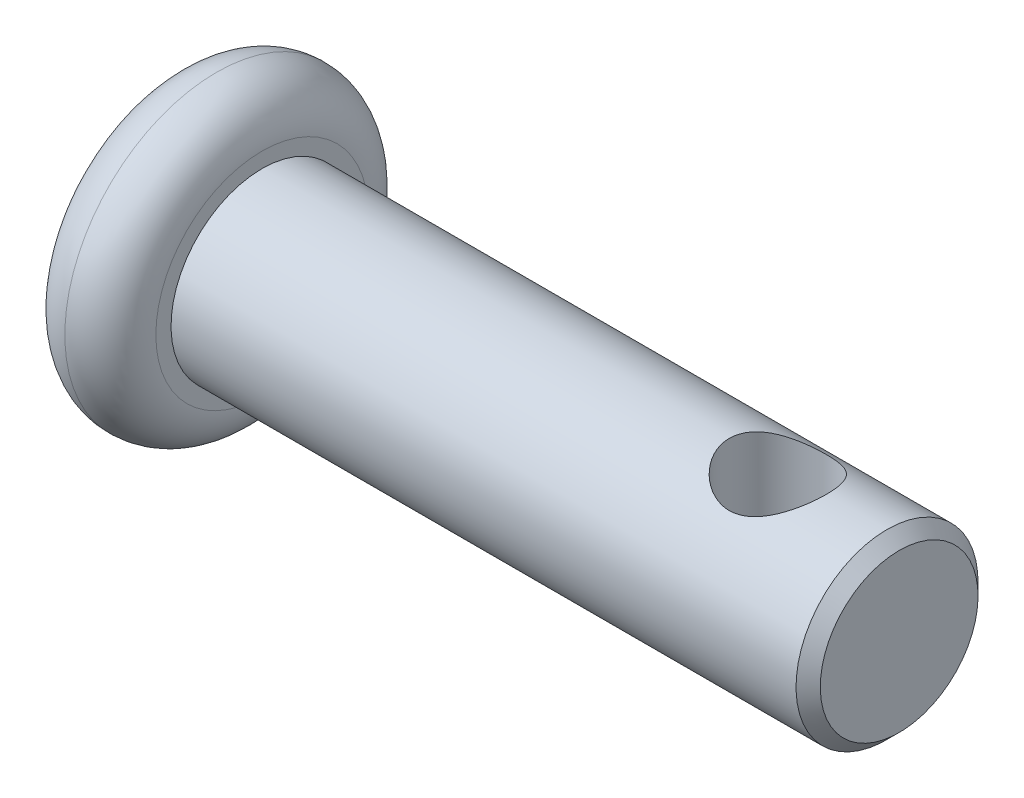
ISO-10303-21;
HEADER;
FILE_DESCRIPTION(('STEP AP214'),'2;1');
FILE_NAME('part.step','',(''),(''),'','','');
FILE_SCHEMA(('AUTOMOTIVE_DESIGN { 1 0 10303 214 1 1 1 1 }'));
ENDSEC;
DATA;
#1=APPLICATION_CONTEXT('core data for automotive mechanical design processes');
#2=APPLICATION_PROTOCOL_DEFINITION('international standard','automotive_design',2000,#1);
#3=PRODUCT_CONTEXT('',#1,'mechanical');
#4=PRODUCT('Part','Part','',(#3));
#5=PRODUCT_RELATED_PRODUCT_CATEGORY('part','',(#4));
#6=PRODUCT_DEFINITION_FORMATION('','',#4);
#7=PRODUCT_DEFINITION_CONTEXT('part definition',#1,'design');
#8=PRODUCT_DEFINITION('design','',#6,#7);
#9=PRODUCT_DEFINITION_SHAPE('','',#8);
#10=(LENGTH_UNIT() NAMED_UNIT(*) SI_UNIT(.MILLI.,.METRE.));
#11=(NAMED_UNIT(*) PLANE_ANGLE_UNIT() SI_UNIT($,.RADIAN.));
#12=(NAMED_UNIT(*) SI_UNIT($,.STERADIAN.) SOLID_ANGLE_UNIT());
#13=UNCERTAINTY_MEASURE_WITH_UNIT(LENGTH_MEASURE(1.E-05),#10,'distance_accuracy_value','');
#14=(GEOMETRIC_REPRESENTATION_CONTEXT(3) GLOBAL_UNCERTAINTY_ASSIGNED_CONTEXT((#13)) GLOBAL_UNIT_ASSIGNED_CONTEXT((#10,
#11,#12)) REPRESENTATION_CONTEXT('',''));
#15=CARTESIAN_POINT('',(0.,0.,0.));
#16=DIRECTION('',(0.,0.,1.));
#17=DIRECTION('',(1.,0.,0.));
#18=AXIS2_PLACEMENT_3D('',#15,#16,#17);
#19=CARTESIAN_POINT('',(0.,0.,0.));
#20=DIRECTION('',(-1.,0.,0.));
#21=DIRECTION('',(0.,-1.,0.));
#22=AXIS2_PLACEMENT_3D('',#19,#20,#21);
#23=PLANE('',#22);
#24=CARTESIAN_POINT('',(0.,0.,0.));
#25=DIRECTION('',(-1.,0.,0.));
#26=DIRECTION('',(0.,-1.,0.));
#27=AXIS2_PLACEMENT_3D('',#24,#25,#26);
#28=CIRCLE('',#27,1.75);
#29=CARTESIAN_POINT('',(0.,-1.75,0.));
#30=VERTEX_POINT('',#29);
#31=EDGE_CURVE('E40',#30,#30,#28,.T.);
#32=ORIENTED_EDGE('',*,*,#31,.T.);
#33=EDGE_LOOP('',(#32));
#34=FACE_BOUND('',#33,.T.);
#35=ADVANCED_FACE('F32',(#34),#23,.T.);
#36=CARTESIAN_POINT('',(1.5,2.5,0.));
#37=DIRECTION('',(1.,0.,0.));
#38=DIRECTION('',(0.,1.,0.));
#39=AXIS2_PLACEMENT_3D('',#36,#37,#38);
#40=PLANE('',#39);
#41=CARTESIAN_POINT('',(1.5,0.,0.));
#42=DIRECTION('',(1.,0.,0.));
#43=DIRECTION('',(0.,1.,0.));
#44=AXIS2_PLACEMENT_3D('',#41,#42,#43);
#45=CIRCLE('',#44,1.75);
#46=CARTESIAN_POINT('',(1.5,1.75,0.));
#47=VERTEX_POINT('',#46);
#48=EDGE_CURVE('E10',#47,#47,#45,.T.);
#49=ORIENTED_EDGE('',*,*,#48,.T.);
#50=EDGE_LOOP('',(#49));
#51=FACE_BOUND('',#50,.T.);
#52=CARTESIAN_POINT('',(1.5,0.,0.));
#53=DIRECTION('',(1.,0.,0.));
#54=DIRECTION('',(0.,1.,0.));
#55=AXIS2_PLACEMENT_3D('',#52,#53,#54);
#56=CIRCLE('',#55,1.5);
#57=CARTESIAN_POINT('',(1.5,1.5,0.));
#58=VERTEX_POINT('',#57);
#59=EDGE_CURVE('E52',#58,#58,#56,.T.);
#60=ORIENTED_EDGE('',*,*,#59,.F.);
#61=EDGE_LOOP('',(#60));
#62=FACE_BOUND('',#61,.T.);
#63=ADVANCED_FACE('F82',(#51,#62),#40,.T.);
#64=CARTESIAN_POINT('',(12.,0.,0.));
#65=DIRECTION('',(1.,0.,0.));
#66=DIRECTION('',(0.,1.,0.));
#67=AXIS2_PLACEMENT_3D('',#64,#65,#66);
#68=CYLINDRICAL_SURFACE('',#67,1.5);
#69=CARTESIAN_POINT('',(11.8,0.,0.));
#70=DIRECTION('',(1.,0.,0.));
#71=DIRECTION('',(0.,1.,0.));
#72=AXIS2_PLACEMENT_3D('',#69,#70,#71);
#73=CIRCLE('',#72,1.5);
#74=CARTESIAN_POINT('',(11.8,1.5,0.));
#75=VERTEX_POINT('',#74);
#76=EDGE_CURVE('E44',#75,#75,#73,.F.);
#77=ORIENTED_EDGE('',*,*,#76,.T.);
#78=EDGE_LOOP('',(#77));
#79=FACE_BOUND('',#78,.T.);
#80=CARTESIAN_POINT('',(9.2,1.5,0.));
#81=CARTESIAN_POINT('',(9.20000270828978,1.49999758414449,0.0417140042937091));
#82=CARTESIAN_POINT('',(9.20328159641244,1.49824189360224,0.0834672912539171));
#83=CARTESIAN_POINT('',(9.21624170086605,1.49139129667971,0.165718197334509));
#84=CARTESIAN_POINT('',(9.22593283300351,1.48629121869364,0.206213769841148));
#85=CARTESIAN_POINT('',(9.25121983985831,1.47328036800654,0.284638594945812));
#86=CARTESIAN_POINT('',(9.26679181418988,1.465380979915,0.322577512237573));
#87=CARTESIAN_POINT('',(9.30326255171199,1.4474774987237,0.395235474229212));
#88=CARTESIAN_POINT('',(9.3241613390756,1.43747339607276,0.429954504316264));
#89=CARTESIAN_POINT('',(9.37225156173175,1.41547900666031,0.49776731945964));
#90=CARTESIAN_POINT('',(9.39976760351975,1.4034011481073,0.530602027463186));
#91=CARTESIAN_POINT('',(9.45960314568675,1.37887042167267,0.591434030661654));
#92=CARTESIAN_POINT('',(9.49192680673365,1.36641723648963,0.619427089896367));
#93=CARTESIAN_POINT('',(9.56397805847776,1.34122140682262,0.6723544195111));
#94=CARTESIAN_POINT('',(9.60411204866305,1.32855595701365,0.696776837026745));
#95=CARTESIAN_POINT('',(9.68864568135116,1.30586838669548,0.738426416316997));
#96=CARTESIAN_POINT('',(9.73304199480675,1.29584422578236,0.755659138193532));
#97=CARTESIAN_POINT('',(9.82205426936129,1.28057394848523,0.781243551670883));
#98=CARTESIAN_POINT('',(9.86648297209041,1.27506829565278,0.790083117424792));
#99=CARTESIAN_POINT('',(9.95650387196575,1.26881331156942,0.800094972405449));
#100=CARTESIAN_POINT('',(10.0020945261342,1.26805797215382,0.801276946959554));
#101=CARTESIAN_POINT('',(10.0862218656466,1.27118648805135,0.796296021649254));
#102=CARTESIAN_POINT('',(10.1248484466222,1.2744325135639,0.791143222976707));
#103=CARTESIAN_POINT('',(10.200574623942,1.28406317281931,0.775413455073685));
#104=CARTESIAN_POINT('',(10.2376735995057,1.29044906914779,0.764834303757537));
#105=CARTESIAN_POINT('',(10.3103380265736,1.30576277857079,0.738390252390663));
#106=CARTESIAN_POINT('',(10.345850303085,1.31474447400447,0.722411944930875));
#107=CARTESIAN_POINT('',(10.4138695263574,1.33425047082889,0.685716522966989));
#108=CARTESIAN_POINT('',(10.446375132369,1.34477545505385,0.664997308543693));
#109=CARTESIAN_POINT('',(10.5124858612133,1.36804524940245,0.615868522436845));
#110=CARTESIAN_POINT('',(10.5455507352467,1.38088899493241,0.586776291159892));
#111=CARTESIAN_POINT('',(10.6065753576899,1.40611558623123,0.523451373374353));
#112=CARTESIAN_POINT('',(10.6345319907931,1.41849814710228,0.489215573049463));
#113=CARTESIAN_POINT('',(10.6861377149142,1.44230010999534,0.414022077031181));
#114=CARTESIAN_POINT('',(10.7094311081939,1.45361823088172,0.372785484410792));
#115=CARTESIAN_POINT('',(10.7485478831769,1.47310395304255,0.286226859736145));
#116=CARTESIAN_POINT('',(10.7643779320031,1.48127436501701,0.240908517249559));
#117=CARTESIAN_POINT('',(10.7866776124073,1.4929099561423,0.151832213955906));
#118=CARTESIAN_POINT('',(10.79386070131,1.49673204992477,0.108300131382032));
#119=CARTESIAN_POINT('',(10.8009475032004,1.50050221027202,0.0204895975412045));
#120=CARTESIAN_POINT('',(10.8008554258023,1.50045251716091,-0.0237884072843997));
#121=CARTESIAN_POINT('',(10.7937500711693,1.49667382258832,-0.107545959760607));
#122=CARTESIAN_POINT('',(10.7873653592517,1.49327897244287,-0.147096449267731));
#123=CARTESIAN_POINT('',(10.7688925579021,1.48362188327846,-0.224469554831582));
#124=CARTESIAN_POINT('',(10.7568038751433,1.47735934596487,-0.262291990687246));
#125=CARTESIAN_POINT('',(10.7270250575318,1.46232570811689,-0.336250167522202));
#126=CARTESIAN_POINT('',(10.7092027650817,1.4534959496239,-0.372320333376869));
#127=CARTESIAN_POINT('',(10.6686248456984,1.43413438081761,-0.441062157410961));
#128=CARTESIAN_POINT('',(10.6458672936231,1.42360190671964,-0.473732482002725));
#129=CARTESIAN_POINT('',(10.5932551988923,1.40047645695353,-0.538489644606411));
#130=CARTESIAN_POINT('',(10.5629003326711,1.38778372966929,-0.570134865108251));
#131=CARTESIAN_POINT('',(10.4973871640848,1.36252708549313,-0.628109862741502));
#132=CARTESIAN_POINT('',(10.462224461708,1.34996329805962,-0.654434715474711));
#133=CARTESIAN_POINT('',(10.385173513825,1.32549514327965,-0.70274076630891));
#134=CARTESIAN_POINT('',(10.3429918612206,1.31369210729127,-0.724310244689175));
#135=CARTESIAN_POINT('',(10.2547899099138,1.29347935062968,-0.759824848176573));
#136=CARTESIAN_POINT('',(10.2087751858783,1.28506480237657,-0.773780830369481));
#137=CARTESIAN_POINT('',(10.1189861529025,1.27372513461018,-0.792295451806952));
#138=CARTESIAN_POINT('',(10.0754338162845,1.27034308682665,-0.797640611545244));
#139=CARTESIAN_POINT('',(9.98793968581964,1.26816359887642,-0.801103834511685));
#140=CARTESIAN_POINT('',(9.94399817787744,1.26936303319562,-0.79922682474004));
#141=CARTESIAN_POINT('',(9.86265364514195,1.27570247677833,-0.78905635074418));
#142=CARTESIAN_POINT('',(9.82510510927249,1.28034575552508,-0.781570591370405));
#143=CARTESIAN_POINT('',(9.75186604245893,1.29238691721072,-0.761493436479323));
#144=CARTESIAN_POINT('',(9.71617620611579,1.29978582163338,-0.748900147495983));
#145=CARTESIAN_POINT('',(9.64509522045344,1.31707665574429,-0.718080352112419));
#146=CARTESIAN_POINT('',(9.60987143258423,1.32709848411839,-0.699543207429633));
#147=CARTESIAN_POINT('',(9.54279806424025,1.34833960706443,-0.657671226676288));
#148=CARTESIAN_POINT('',(9.51095031464064,1.35955954483521,-0.634333807313367));
#149=CARTESIAN_POINT('',(9.44672690611971,1.38387269806827,-0.579583602633469));
#150=CARTESIAN_POINT('',(9.41494125955117,1.39700212075101,-0.547491018352181));
#151=CARTESIAN_POINT('',(9.35702772961191,1.42222830059072,-0.478150164559821));
#152=CARTESIAN_POINT('',(9.3309035088962,1.43432438618419,-0.440898582826826));
#153=CARTESIAN_POINT('',(9.28456604006334,1.45651015109521,-0.3610220026222));
#154=CARTESIAN_POINT('',(9.26451137357511,1.4665441059256,-0.318288665753909));
#155=CARTESIAN_POINT('',(9.23214637726612,1.48303856571174,-0.229399331630397));
#156=CARTESIAN_POINT('',(9.21981536787766,1.48950860714735,-0.183252846928634));
#157=CARTESIAN_POINT('',(9.20780732872793,1.49584776109147,-0.113807677907483));
#158=CARTESIAN_POINT('',(9.20488511579837,1.49739944315896,-0.0911777471195395));
#159=CARTESIAN_POINT('',(9.20098069784147,1.49947623062919,-0.0457024774465215));
#160=CARTESIAN_POINT('',(9.19999851599603,1.50000132376498,-0.0228571359907307));
#161=CARTESIAN_POINT('',(9.2,1.5,0.));
#162=B_SPLINE_CURVE_WITH_KNOTS('',3,(#80,#81,#82,#83,#84,#85,#86,#87,#88,#89,#90,#91,#92,#93,
#94,#95,#96,#97,#98,#99,#100,#101,#102,#103,#104,#105,#106,#107,#108,#109,#110,#111,#112,#113,
#114,#115,#116,#117,#118,#119,#120,#121,#122,#123,#124,#125,#126,#127,#128,#129,#130,#131,#132,
#133,#134,#135,#136,#137,#138,#139,#140,#141,#142,#143,#144,#145,#146,#147,#148,#149,#150,#151,
#152,#153,#154,#155,#156,#157,#158,#159,#160,#161),.UNSPECIFIED.,.T.,.F.,(4,2,2,2,2,2,2,2,2,2,2,
2,2,2,2,2,2,2,2,2,2,2,2,2,2,2,2,2,2,2,2,2,2,2,2,2,2,2,2,2,4),(0.,0.125049785968992,
0.250293400579708,0.375033395431379,0.499773956363372,0.632758937517728,0.765859685119312,
0.911100210896856,1.0562282067719,1.19228300426694,1.32816568589671,1.44492819552126,
1.5617376954166,1.68117137196064,1.80065805275817,1.93770170276478,2.07482865313358,
2.22012229846782,2.3652859036198,2.49740165319181,2.62944095746675,2.74950324975936,
2.86957803367867,2.99264692026345,3.11576390008819,3.25213772585141,3.38863720347796,
3.53432584534744,3.6798061838978,3.81103787448892,3.94218005404205,4.0573808881827,
4.17262446873054,4.29529226385602,4.41802624681408,4.55851375899382,4.69909188991155,
4.84307664846754,4.98667423094967,5.05519428454422,5.12371515689634),.UNSPECIFIED.);
#163=CARTESIAN_POINT('',(9.2,1.5,0.));
#164=VERTEX_POINT('',#163);
#165=EDGE_CURVE('E53',#164,#164,#162,.T.);
#166=ORIENTED_EDGE('',*,*,#165,.F.);
#167=EDGE_LOOP('',(#166));
#168=FACE_BOUND('',#167,.T.);
#169=CARTESIAN_POINT('',(10.,-1.26885775404495,0.800000000000001));
#170=CARTESIAN_POINT('',(9.95876273448102,-1.26886196661874,0.799996864513053));
#171=CARTESIAN_POINT('',(9.91748371741335,-1.27089944626369,0.796789664925114));
#172=CARTESIAN_POINT('',(9.83622918262843,-1.27873921411508,0.784141291009919));
#173=CARTESIAN_POINT('',(9.79625617587688,-1.28454835234237,0.774688773493131));
#174=CARTESIAN_POINT('',(9.71894780075035,-1.29905904209521,0.750097396273411));
#175=CARTESIAN_POINT('',(9.68159836681702,-1.30774346962922,0.734992134110891));
#176=CARTESIAN_POINT('',(9.60997576954858,-1.32699887256592,0.69962725675374));
#177=CARTESIAN_POINT('',(9.57570310617982,-1.3375701537459,0.679366805899384));
#178=CARTESIAN_POINT('',(9.50763512901068,-1.36062558490873,0.632023751834456));
#179=CARTESIAN_POINT('',(9.47419170036702,-1.3731960879889,0.604477080012549));
#180=CARTESIAN_POINT('',(9.41212005528414,-1.39813960186555,0.544304228810776));
#181=CARTESIAN_POINT('',(9.38349454471824,-1.41051249817365,0.511675214724456));
#182=CARTESIAN_POINT('',(9.32963996141888,-1.43483798338866,0.439108047858338));
#183=CARTESIAN_POINT('',(9.304860459726,-1.44667936834788,0.398795407866639));
#184=CARTESIAN_POINT('',(9.26259797647828,-1.4674543508573,0.313822774935417));
#185=CARTESIAN_POINT('',(9.24510976512043,-1.47639003155784,0.269165926407688));
#186=CARTESIAN_POINT('',(9.21937664657649,-1.48971871408987,0.180514514600767));
#187=CARTESIAN_POINT('',(9.21050978019938,-1.49441524613383,0.136747205617519));
#188=CARTESIAN_POINT('',(9.2002055395077,-1.49988363624653,0.0481154730549633));
#189=CARTESIAN_POINT('',(9.19876293639262,-1.50065825645443,0.00325184397865781));
#190=CARTESIAN_POINT('',(9.20314814610807,-1.49832286926248,-0.0815499999521922));
#191=CARTESIAN_POINT('',(9.20827296583656,-1.49558843812923,-0.121537611195849));
#192=CARTESIAN_POINT('',(9.22436516427562,-1.48713233848782,-0.199984967913363));
#193=CARTESIAN_POINT('',(9.23533298696442,-1.48141044297903,-0.23844459704545));
#194=CARTESIAN_POINT('',(9.26282653204051,-1.46740708636072,-0.313348321881751));
#195=CARTESIAN_POINT('',(9.27941733047303,-1.45909575243493,-0.349762714854437));
#196=CARTESIAN_POINT('',(9.31757252211393,-1.44063483401394,-0.419368306071068));
#197=CARTESIAN_POINT('',(9.33913858422317,-1.43048463293557,-0.452558417442183));
#198=CARTESIAN_POINT('',(9.38918335498132,-1.40802908686015,-0.518447006228245));
#199=CARTESIAN_POINT('',(9.41814666337508,-1.39560941242776,-0.550738571603077));
#200=CARTESIAN_POINT('',(9.48088657940783,-1.37063855232126,-0.610240413321967));
#201=CARTESIAN_POINT('',(9.51466771168158,-1.35808725341624,-0.637445856922973));
#202=CARTESIAN_POINT('',(9.58932639200896,-1.3331614362403,-0.688142739262386));
#203=CARTESIAN_POINT('',(9.63055416846914,-1.32087975949967,-0.711168968556946));
#204=CARTESIAN_POINT('',(9.71707859110982,-1.29934599305322,-0.749795437753228));
#205=CARTESIAN_POINT('',(9.76237055297204,-1.2900904711841,-0.765404099589991));
#206=CARTESIAN_POINT('',(9.85192286394624,-1.27676652055074,-0.787414593051426));
#207=CARTESIAN_POINT('',(9.89596877850799,-1.27233817524479,-0.794460652312184));
#208=CARTESIAN_POINT('',(9.9848221695914,-1.26817570645215,-0.801092295961595));
#209=CARTESIAN_POINT('',(10.0296288654787,-1.2684370311012,-0.800685114570187));
#210=CARTESIAN_POINT('',(10.1123609659239,-1.27324146590537,-0.793012576559901));
#211=CARTESIAN_POINT('',(10.1504109201346,-1.27721214325595,-0.786663890603778));
#212=CARTESIAN_POINT('',(10.2248111870943,-1.28809322443618,-0.768716567904852));
#213=CARTESIAN_POINT('',(10.2611608273113,-1.29500478075102,-0.757115872866362));
#214=CARTESIAN_POINT('',(10.3329865456766,-1.31133528432453,-0.728478896070427));
#215=CARTESIAN_POINT('',(10.3683526520711,-1.32085171604477,-0.71122465174705));
#216=CARTESIAN_POINT('',(10.4358984076819,-1.341256427032,-0.671952934296526));
#217=CARTESIAN_POINT('',(10.4680764236029,-1.35214540304482,-0.64993303787797));
#218=CARTESIAN_POINT('',(10.5332946654189,-1.37599067873093,-0.597980606850556));
#219=CARTESIAN_POINT('',(10.5657647590195,-1.38901537145197,-0.567360485146422));
#220=CARTESIAN_POINT('',(10.6253173878375,-1.41431776647649,-0.500966861660939));
#221=CARTESIAN_POINT('',(10.6523972493855,-1.42659509598649,-0.465190817525478));
#222=CARTESIAN_POINT('',(10.701420887761,-1.44965641221178,-0.387557548308533));
#223=CARTESIAN_POINT('',(10.7231044425832,-1.46035713214021,-0.345509385844548));
#224=CARTESIAN_POINT('',(10.7588620401344,-1.47838829057854,-0.257628537747276));
#225=CARTESIAN_POINT('',(10.7729436099377,-1.48572206177842,-0.211799647624746));
#226=CARTESIAN_POINT('',(10.7917408730137,-1.49559252183209,-0.122542623944412));
#227=CARTESIAN_POINT('',(10.7972449020086,-1.49853179980277,-0.0793251002202924));
#228=CARTESIAN_POINT('',(10.8011427516989,-1.50060859243268,0.00751346654484927));
#229=CARTESIAN_POINT('',(10.7995398423889,-1.49974785552879,0.0511343147932566));
#230=CARTESIAN_POINT('',(10.7897415347638,-1.49454920950015,0.133788994579343));
#231=CARTESIAN_POINT('',(10.7820915214264,-1.49049906133755,0.172907860140318));
#232=CARTESIAN_POINT('',(10.7612187145492,-1.47965354156647,0.249221877864195));
#233=CARTESIAN_POINT('',(10.7479952154813,-1.47285782241034,0.286416785810594));
#234=CARTESIAN_POINT('',(10.7158659413127,-1.45679902343012,0.359425889447873));
#235=CARTESIAN_POINT('',(10.6967646922467,-1.44745256335821,0.395135125917098));
#236=CARTESIAN_POINT('',(10.6536623978907,-1.42720451643219,0.462971321864473));
#237=CARTESIAN_POINT('',(10.6296592408005,-1.41630225993429,0.495096728131305));
#238=CARTESIAN_POINT('',(10.5743868017919,-1.39256226025897,0.558607472252003));
#239=CARTESIAN_POINT('',(10.5426080235873,-1.37964368678354,0.589520072630632));
#240=CARTESIAN_POINT('',(10.4742543886591,-1.35421972738329,0.645789943977252));
#241=CARTESIAN_POINT('',(10.4376743052182,-1.34171481061365,0.671141079191599));
#242=CARTESIAN_POINT('',(10.3582714452726,-1.31789525425206,0.716834489773426));
#243=CARTESIAN_POINT('',(10.3152183752009,-1.30668119417457,0.736832850041601));
#244=CARTESIAN_POINT('',(10.2255851394643,-1.28801884527121,0.76899969476833));
#245=CARTESIAN_POINT('',(10.1790170766059,-1.2805582568072,0.781193789013041));
#246=CARTESIAN_POINT('',(10.1098759937845,-1.27342167136347,0.792724634734879));
#247=CARTESIAN_POINT('',(10.0880295511891,-1.27171869731202,0.795447128930462));
#248=CARTESIAN_POINT('',(10.0441260636661,-1.26943559027159,0.799085684611176));
#249=CARTESIAN_POINT('',(10.0220690108339,-1.26885549959535,0.800001678023375));
#250=CARTESIAN_POINT('',(10.,-1.26885775404495,0.800000000000001));
#251=B_SPLINE_CURVE_WITH_KNOTS('',3,(#169,#170,#171,#172,#173,#174,#175,#176,#177,#178,#179,
#180,#181,#182,#183,#184,#185,#186,#187,#188,#189,#190,#191,#192,#193,#194,#195,#196,#197,#198,
#199,#200,#201,#202,#203,#204,#205,#206,#207,#208,#209,#210,#211,#212,#213,#214,#215,#216,#217,
#218,#219,#220,#221,#222,#223,#224,#225,#226,#227,#228,#229,#230,#231,#232,#233,#234,#235,#236,
#237,#238,#239,#240,#241,#242,#243,#244,#245,#246,#247,#248,#249,#250),.UNSPECIFIED.,.T.,.F.,(4,
2,2,2,2,2,2,2,2,2,2,2,2,2,2,2,2,2,2,2,2,2,2,2,2,2,2,2,2,2,2,2,2,2,2,2,2,2,2,2,4),(0.,
0.123618473587386,0.247462091316307,0.370581032680868,0.493719944441368,0.628508086262541,
0.763371677962653,0.908933729355958,1.05439119350289,1.18833771084821,1.32218987868886,
1.44284125255474,1.56350179537475,1.68560936718269,1.80775795842542,1.94255700923056,
2.07748349986593,2.22310306735306,2.36855690043649,2.50220973902214,2.63573285917238,
2.75154856612197,2.86740970132553,2.98840170593533,3.10945537905413,3.24832564333197,
3.38726461948578,3.53197776928605,3.67654736791846,3.80682374917256,3.93704019479742,
4.05669244864876,4.17635985340895,4.30053990923031,4.42477357658543,4.56271446031725,
4.70080677207371,4.84634738140328,4.99140791510708,5.05756251100806,5.12371959971245),.UNSPECIFIED.);
#252=CARTESIAN_POINT('',(10.,-1.26885775404495,0.800000000000001));
#253=VERTEX_POINT('',#252);
#254=EDGE_CURVE('E61',#253,#253,#251,.T.);
#255=ORIENTED_EDGE('',*,*,#254,.F.);
#256=EDGE_LOOP('',(#255));
#257=FACE_BOUND('',#256,.T.);
#258=ORIENTED_EDGE('',*,*,#59,.T.);
#259=EDGE_LOOP('',(#258));
#260=FACE_BOUND('',#259,.T.);
#261=ADVANCED_FACE('F66',(#79,#168,#257,#260),#68,.T.);
#262=CARTESIAN_POINT('',(12.,1.5,0.));
#263=DIRECTION('',(1.,0.,0.));
#264=DIRECTION('',(0.,1.,0.));
#265=AXIS2_PLACEMENT_3D('',#262,#263,#264);
#266=PLANE('',#265);
#267=CARTESIAN_POINT('',(12.,0.,0.));
#268=DIRECTION('',(1.,0.,0.));
#269=DIRECTION('',(0.,1.,0.));
#270=AXIS2_PLACEMENT_3D('',#267,#268,#269);
#271=CIRCLE('',#270,1.29999999999999);
#272=CARTESIAN_POINT('',(12.,1.3,0.));
#273=VERTEX_POINT('',#272);
#274=EDGE_CURVE('E49',#273,#273,#271,.T.);
#275=ORIENTED_EDGE('',*,*,#274,.T.);
#276=EDGE_LOOP('',(#275));
#277=FACE_BOUND('',#276,.T.);
#278=ADVANCED_FACE('F74',(#277),#266,.T.);
#279=CARTESIAN_POINT('',(10.,-10.,0.));
#280=DIRECTION('',(0.,1.,0.));
#281=DIRECTION('',(0.,0.,1.));
#282=AXIS2_PLACEMENT_3D('',#279,#280,#281);
#283=CYLINDRICAL_SURFACE('',#282,0.800000000000001);
#284=ORIENTED_EDGE('',*,*,#165,.T.);
#285=EDGE_LOOP('',(#284));
#286=FACE_BOUND('',#285,.T.);
#287=ORIENTED_EDGE('',*,*,#254,.T.);
#288=EDGE_LOOP('',(#287));
#289=FACE_BOUND('',#288,.T.);
#290=ADVANCED_FACE('F70',(#286,#289),#283,.F.);
#291=CARTESIAN_POINT('',(12.,0.,0.));
#292=DIRECTION('',(-1.,0.,0.));
#293=DIRECTION('',(0.,-1.,0.));
#294=AXIS2_PLACEMENT_3D('',#291,#292,#293);
#295=CONICAL_SURFACE('',#294,1.29999999999999,0.785398163397444);
#296=ORIENTED_EDGE('',*,*,#76,.F.);
#297=EDGE_LOOP('',(#296));
#298=FACE_BOUND('',#297,.T.);
#299=ORIENTED_EDGE('',*,*,#274,.F.);
#300=EDGE_LOOP('',(#299));
#301=FACE_BOUND('',#300,.T.);
#302=ADVANCED_FACE('F73',(#298,#301),#295,.T.);
#303=CARTESIAN_POINT('',(0.750000000000001,0.,0.));
#304=DIRECTION('',(1.,0.,0.));
#305=DIRECTION('',(0.,1.,0.));
#306=AXIS2_PLACEMENT_3D('',#303,#304,#305);
#307=TOROIDAL_SURFACE('',#306,1.75,0.75);
#308=ORIENTED_EDGE('',*,*,#48,.F.);
#309=EDGE_LOOP('',(#308));
#310=FACE_BOUND('',#309,.T.);
#311=CARTESIAN_POINT('',(0.750000000000001,0.,0.));
#312=DIRECTION('',(1.,0.,0.));
#313=DIRECTION('',(0.,1.,0.));
#314=AXIS2_PLACEMENT_3D('',#311,#312,#313);
#315=CIRCLE('',#314,2.5);
#316=CARTESIAN_POINT('',(0.75,2.5,0.));
#317=VERTEX_POINT('',#316);
#318=EDGE_CURVE('E36',#317,#317,#315,.F.);
#319=ORIENTED_EDGE('',*,*,#318,.F.);
#320=EDGE_LOOP('',(#319));
#321=FACE_BOUND('',#320,.T.);
#322=ADVANCED_FACE('F34',(#310,#321),#307,.T.);
#323=CARTESIAN_POINT('',(0.750000000000001,0.,0.));
#324=DIRECTION('',(-1.,0.,0.));
#325=DIRECTION('',(0.,-1.,0.));
#326=AXIS2_PLACEMENT_3D('',#323,#324,#325);
#327=TOROIDAL_SURFACE('',#326,1.75,0.75);
#328=ORIENTED_EDGE('',*,*,#31,.F.);
#329=EDGE_LOOP('',(#328));
#330=FACE_BOUND('',#329,.T.);
#331=ORIENTED_EDGE('',*,*,#318,.T.);
#332=EDGE_LOOP('',(#331));
#333=FACE_BOUND('',#332,.T.);
#334=ADVANCED_FACE('F93',(#330,#333),#327,.T.);
#335=CLOSED_SHELL('',(#35,#63,#261,#278,#290,#302,#322,#334));
#336=MANIFOLD_SOLID_BREP('B2',#335);
#337=ADVANCED_BREP_SHAPE_REPRESENTATION('',(#18,#336),#14);
#338=SHAPE_DEFINITION_REPRESENTATION(#9,#337);
ENDSEC;
END-ISO-10303-21;
